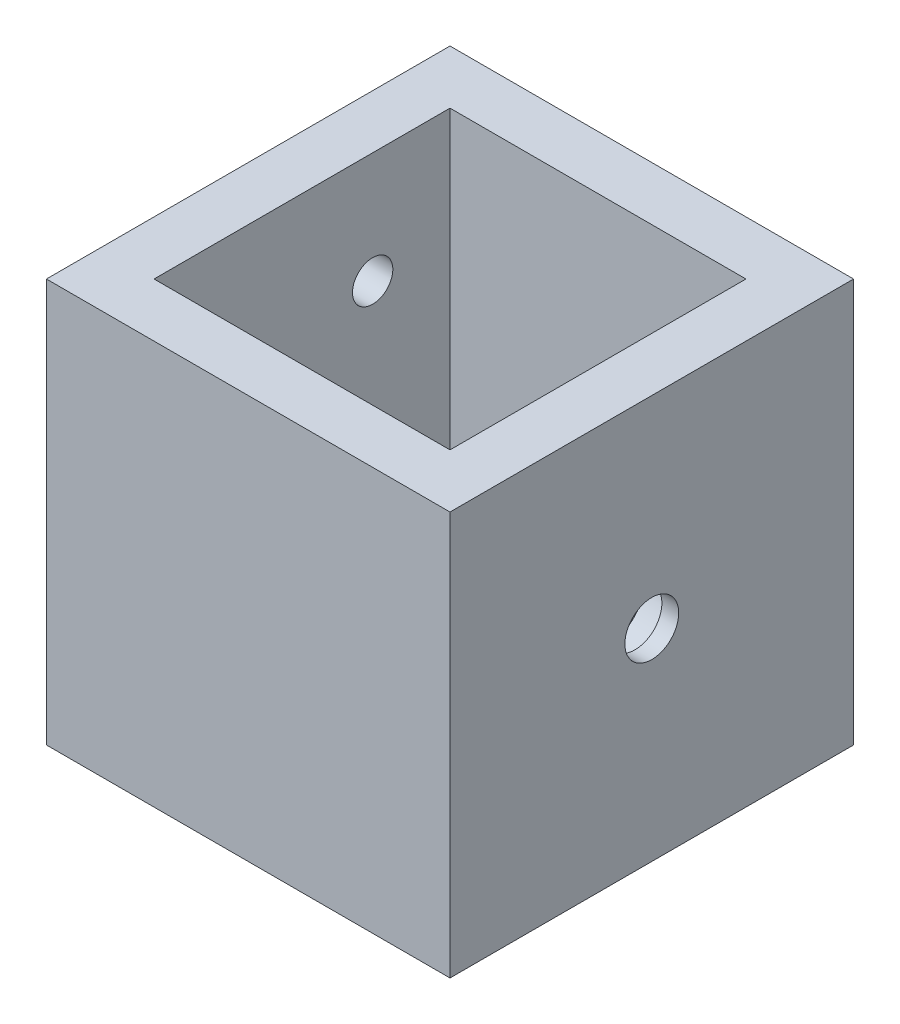
ISO-10303-21;
HEADER;
FILE_DESCRIPTION(('STEP AP214'),'2;1');
FILE_NAME('part.step','',(''),(''),'','','');
FILE_SCHEMA(('AUTOMOTIVE_DESIGN { 1 0 10303 214 1 1 1 1 }'));
ENDSEC;
DATA;
#1=APPLICATION_CONTEXT('core data for automotive mechanical design processes');
#2=APPLICATION_PROTOCOL_DEFINITION('international standard','automotive_design',2000,#1);
#3=PRODUCT_CONTEXT('',#1,'mechanical');
#4=PRODUCT('Part','Part','',(#3));
#5=PRODUCT_RELATED_PRODUCT_CATEGORY('part','',(#4));
#6=PRODUCT_DEFINITION_FORMATION('','',#4);
#7=PRODUCT_DEFINITION_CONTEXT('part definition',#1,'design');
#8=PRODUCT_DEFINITION('design','',#6,#7);
#9=PRODUCT_DEFINITION_SHAPE('','',#8);
#10=(LENGTH_UNIT() NAMED_UNIT(*) SI_UNIT(.MILLI.,.METRE.));
#11=(NAMED_UNIT(*) PLANE_ANGLE_UNIT() SI_UNIT($,.RADIAN.));
#12=(NAMED_UNIT(*) SI_UNIT($,.STERADIAN.) SOLID_ANGLE_UNIT());
#13=UNCERTAINTY_MEASURE_WITH_UNIT(LENGTH_MEASURE(1.E-05),#10,'distance_accuracy_value','');
#14=(GEOMETRIC_REPRESENTATION_CONTEXT(3) GLOBAL_UNCERTAINTY_ASSIGNED_CONTEXT((#13)) GLOBAL_UNIT_ASSIGNED_CONTEXT((#10,
#11,#12)) REPRESENTATION_CONTEXT('',''));
#15=CARTESIAN_POINT('',(0.,0.,0.));
#16=DIRECTION('',(0.,0.,1.));
#17=DIRECTION('',(1.,0.,0.));
#18=AXIS2_PLACEMENT_3D('',#15,#16,#17);
#19=CARTESIAN_POINT('',(130.,30.,0.));
#20=DIRECTION('',(-1.,0.,0.));
#21=DIRECTION('',(0.,0.,1.));
#22=AXIS2_PLACEMENT_3D('',#19,#20,#21);
#23=CYLINDRICAL_SURFACE('',#22,4.);
#24=CARTESIAN_POINT('',(30.,30.,0.));
#25=DIRECTION('',(-1.,0.,0.));
#26=DIRECTION('',(0.,0.,1.));
#27=AXIS2_PLACEMENT_3D('',#24,#25,#26);
#28=CIRCLE('',#27,4.);
#29=CARTESIAN_POINT('',(30.,30.,3.99999999999998));
#30=VERTEX_POINT('',#29);
#31=EDGE_CURVE('E233',#30,#30,#28,.T.);
#32=ORIENTED_EDGE('',*,*,#31,.F.);
#33=EDGE_LOOP('',(#32));
#34=FACE_BOUND('',#33,.T.);
#35=CARTESIAN_POINT('',(27.5,30.,0.));
#36=DIRECTION('',(-1.,0.,0.));
#37=DIRECTION('',(0.,0.,1.));
#38=AXIS2_PLACEMENT_3D('',#35,#36,#37);
#39=CIRCLE('',#38,4.);
#40=CARTESIAN_POINT('',(27.5,30.,3.99999999999998));
#41=VERTEX_POINT('',#40);
#42=EDGE_CURVE('E129',#41,#41,#39,.F.);
#43=ORIENTED_EDGE('',*,*,#42,.F.);
#44=EDGE_LOOP('',(#43));
#45=FACE_BOUND('',#44,.T.);
#46=ADVANCED_FACE('F125',(#34,#45),#23,.F.);
#47=CARTESIAN_POINT('',(0.,60.,0.));
#48=DIRECTION('',(0.,1.,0.));
#49=DIRECTION('',(0.,0.,1.));
#50=AXIS2_PLACEMENT_3D('',#47,#48,#49);
#51=PLANE('',#50);
#52=DIRECTION('',(0.,0.,-1.));
#53=VECTOR('',#52,1.);
#54=CARTESIAN_POINT('',(30.,60.,-30.));
#55=LINE('',#54,#53);
#56=CARTESIAN_POINT('',(30.,60.,30.));
#57=VERTEX_POINT('',#56);
#58=CARTESIAN_POINT('',(30.,60.,-30.));
#59=VERTEX_POINT('',#58);
#60=EDGE_CURVE('E236',#57,#59,#55,.T.);
#61=ORIENTED_EDGE('',*,*,#60,.T.);
#62=DIRECTION('',(-1.,0.,0.));
#63=VECTOR('',#62,1.);
#64=CARTESIAN_POINT('',(-30.,60.,-30.));
#65=LINE('',#64,#63);
#66=CARTESIAN_POINT('',(-30.,60.,-30.));
#67=VERTEX_POINT('',#66);
#68=EDGE_CURVE('E240',#59,#67,#65,.T.);
#69=ORIENTED_EDGE('',*,*,#68,.T.);
#70=DIRECTION('',(0.,0.,1.));
#71=VECTOR('',#70,1.);
#72=CARTESIAN_POINT('',(-30.,60.,-30.));
#73=LINE('',#72,#71);
#74=CARTESIAN_POINT('',(-30.,60.,30.));
#75=VERTEX_POINT('',#74);
#76=EDGE_CURVE('E244',#67,#75,#73,.T.);
#77=ORIENTED_EDGE('',*,*,#76,.T.);
#78=DIRECTION('',(1.,0.,0.));
#79=VECTOR('',#78,1.);
#80=CARTESIAN_POINT('',(-30.,60.,30.));
#81=LINE('',#80,#79);
#82=EDGE_CURVE('E247',#75,#57,#81,.T.);
#83=ORIENTED_EDGE('',*,*,#82,.T.);
#84=EDGE_LOOP('',(#61,#69,#77,#83));
#85=FACE_BOUND('',#84,.T.);
#86=DIRECTION('',(-1.,0.,0.));
#87=VECTOR('',#86,1.);
#88=CARTESIAN_POINT('',(22.,60.,-22.));
#89=LINE('',#88,#87);
#90=CARTESIAN_POINT('',(22.,60.,-22.));
#91=VERTEX_POINT('',#90);
#92=CARTESIAN_POINT('',(-22.,60.,-22.));
#93=VERTEX_POINT('',#92);
#94=EDGE_CURVE('E204',#91,#93,#89,.T.);
#95=ORIENTED_EDGE('',*,*,#94,.F.);
#96=DIRECTION('',(0.,0.,-1.));
#97=VECTOR('',#96,1.);
#98=CARTESIAN_POINT('',(22.,60.,22.));
#99=LINE('',#98,#97);
#100=CARTESIAN_POINT('',(22.,60.,22.));
#101=VERTEX_POINT('',#100);
#102=EDGE_CURVE('E143',#101,#91,#99,.T.);
#103=ORIENTED_EDGE('',*,*,#102,.F.);
#104=DIRECTION('',(1.,0.,0.));
#105=VECTOR('',#104,1.);
#106=CARTESIAN_POINT('',(-22.,60.,22.));
#107=LINE('',#106,#105);
#108=CARTESIAN_POINT('',(-22.,60.,22.));
#109=VERTEX_POINT('',#108);
#110=EDGE_CURVE('E201',#109,#101,#107,.T.);
#111=ORIENTED_EDGE('',*,*,#110,.F.);
#112=DIRECTION('',(0.,0.,1.));
#113=VECTOR('',#112,1.);
#114=CARTESIAN_POINT('',(-22.,60.,-22.));
#115=LINE('',#114,#113);
#116=EDGE_CURVE('E195',#93,#109,#115,.T.);
#117=ORIENTED_EDGE('',*,*,#116,.F.);
#118=EDGE_LOOP('',(#95,#103,#111,#117));
#119=FACE_BOUND('',#118,.T.);
#120=ADVANCED_FACE('F211',(#85,#119),#51,.T.);
#121=CARTESIAN_POINT('',(0.,0.,0.));
#122=DIRECTION('',(0.,1.,0.));
#123=DIRECTION('',(0.,0.,1.));
#124=AXIS2_PLACEMENT_3D('',#121,#122,#123);
#125=PLANE('',#124);
#126=DIRECTION('',(0.,0.,-1.));
#127=VECTOR('',#126,1.);
#128=CARTESIAN_POINT('',(30.,0.,-30.));
#129=LINE('',#128,#127);
#130=CARTESIAN_POINT('',(30.,0.,30.));
#131=VERTEX_POINT('',#130);
#132=CARTESIAN_POINT('',(30.,0.,-30.));
#133=VERTEX_POINT('',#132);
#134=EDGE_CURVE('E209',#131,#133,#129,.T.);
#135=ORIENTED_EDGE('',*,*,#134,.F.);
#136=DIRECTION('',(1.,0.,0.));
#137=VECTOR('',#136,1.);
#138=CARTESIAN_POINT('',(-30.,0.,30.));
#139=LINE('',#138,#137);
#140=CARTESIAN_POINT('',(-30.,0.,30.));
#141=VERTEX_POINT('',#140);
#142=EDGE_CURVE('E241',#141,#131,#139,.T.);
#143=ORIENTED_EDGE('',*,*,#142,.F.);
#144=DIRECTION('',(0.,0.,1.));
#145=VECTOR('',#144,1.);
#146=CARTESIAN_POINT('',(-30.,0.,-30.));
#147=LINE('',#146,#145);
#148=CARTESIAN_POINT('',(-30.,0.,-30.));
#149=VERTEX_POINT('',#148);
#150=EDGE_CURVE('E257',#149,#141,#147,.T.);
#151=ORIENTED_EDGE('',*,*,#150,.F.);
#152=DIRECTION('',(-1.,0.,0.));
#153=VECTOR('',#152,1.);
#154=CARTESIAN_POINT('',(-30.,0.,-30.));
#155=LINE('',#154,#153);
#156=EDGE_CURVE('E254',#133,#149,#155,.T.);
#157=ORIENTED_EDGE('',*,*,#156,.F.);
#158=EDGE_LOOP('',(#135,#143,#151,#157));
#159=FACE_BOUND('',#158,.T.);
#160=DIRECTION('',(0.,0.,1.));
#161=VECTOR('',#160,1.);
#162=CARTESIAN_POINT('',(22.,0.,0.));
#163=LINE('',#162,#161);
#164=CARTESIAN_POINT('',(22.,0.,-22.));
#165=VERTEX_POINT('',#164);
#166=CARTESIAN_POINT('',(22.,0.,22.));
#167=VERTEX_POINT('',#166);
#168=EDGE_CURVE('E14',#165,#167,#163,.T.);
#169=ORIENTED_EDGE('',*,*,#168,.F.);
#170=DIRECTION('',(1.,0.,0.));
#171=VECTOR('',#170,1.);
#172=CARTESIAN_POINT('',(0.,0.,-22.));
#173=LINE('',#172,#171);
#174=CARTESIAN_POINT('',(-22.,0.,-22.));
#175=VERTEX_POINT('',#174);
#176=EDGE_CURVE('E277',#175,#165,#173,.T.);
#177=ORIENTED_EDGE('',*,*,#176,.F.);
#178=DIRECTION('',(0.,0.,-1.));
#179=VECTOR('',#178,1.);
#180=CARTESIAN_POINT('',(-22.,0.,0.));
#181=LINE('',#180,#179);
#182=CARTESIAN_POINT('',(-22.,0.,22.));
#183=VERTEX_POINT('',#182);
#184=EDGE_CURVE('E198',#183,#175,#181,.T.);
#185=ORIENTED_EDGE('',*,*,#184,.F.);
#186=DIRECTION('',(-1.,0.,0.));
#187=VECTOR('',#186,1.);
#188=CARTESIAN_POINT('',(0.,0.,22.));
#189=LINE('',#188,#187);
#190=EDGE_CURVE('E135',#167,#183,#189,.T.);
#191=ORIENTED_EDGE('',*,*,#190,.F.);
#192=EDGE_LOOP('',(#169,#177,#185,#191));
#193=FACE_BOUND('',#192,.T.);
#194=ADVANCED_FACE('F322',(#159,#193),#125,.F.);
#195=CARTESIAN_POINT('',(30.,60.,-30.));
#196=DIRECTION('',(-1.,0.,0.));
#197=DIRECTION('',(0.,0.,1.));
#198=AXIS2_PLACEMENT_3D('',#195,#196,#197);
#199=PLANE('',#198);
#200=ORIENTED_EDGE('',*,*,#31,.T.);
#201=EDGE_LOOP('',(#200));
#202=FACE_BOUND('',#201,.T.);
#203=ORIENTED_EDGE('',*,*,#134,.T.);
#204=DIRECTION('',(0.,-1.,0.));
#205=VECTOR('',#204,1.);
#206=CARTESIAN_POINT('',(30.,60.,-30.));
#207=LINE('',#206,#205);
#208=EDGE_CURVE('E273',#59,#133,#207,.T.);
#209=ORIENTED_EDGE('',*,*,#208,.F.);
#210=ORIENTED_EDGE('',*,*,#60,.F.);
#211=DIRECTION('',(0.,-1.,0.));
#212=VECTOR('',#211,1.);
#213=CARTESIAN_POINT('',(30.,60.,30.));
#214=LINE('',#213,#212);
#215=EDGE_CURVE('E250',#57,#131,#214,.T.);
#216=ORIENTED_EDGE('',*,*,#215,.T.);
#217=EDGE_LOOP('',(#203,#209,#210,#216));
#218=FACE_BOUND('',#217,.T.);
#219=ADVANCED_FACE('F127',(#202,#218),#199,.F.);
#220=CARTESIAN_POINT('',(-30.,60.,-30.));
#221=DIRECTION('',(0.,0.,1.));
#222=DIRECTION('',(1.,0.,0.));
#223=AXIS2_PLACEMENT_3D('',#220,#221,#222);
#224=PLANE('',#223);
#225=ORIENTED_EDGE('',*,*,#156,.T.);
#226=DIRECTION('',(0.,-1.,0.));
#227=VECTOR('',#226,1.);
#228=CARTESIAN_POINT('',(-30.,60.,-30.));
#229=LINE('',#228,#227);
#230=EDGE_CURVE('E269',#67,#149,#229,.T.);
#231=ORIENTED_EDGE('',*,*,#230,.F.);
#232=ORIENTED_EDGE('',*,*,#68,.F.);
#233=ORIENTED_EDGE('',*,*,#208,.T.);
#234=EDGE_LOOP('',(#225,#231,#232,#233));
#235=FACE_BOUND('',#234,.T.);
#236=ADVANCED_FACE('F399',(#235),#224,.F.);
#237=CARTESIAN_POINT('',(-30.,60.,-30.));
#238=DIRECTION('',(1.,0.,0.));
#239=DIRECTION('',(0.,0.,-1.));
#240=AXIS2_PLACEMENT_3D('',#237,#238,#239);
#241=PLANE('',#240);
#242=CARTESIAN_POINT('',(-30.,16.5,-10.5));
#243=DIRECTION('',(-1.,0.,0.));
#244=DIRECTION('',(0.,0.,1.));
#245=AXIS2_PLACEMENT_3D('',#242,#243,#244);
#246=CIRCLE('',#245,3.);
#247=CARTESIAN_POINT('',(-30.,16.5,-7.49999999999999));
#248=VERTEX_POINT('',#247);
#249=EDGE_CURVE('E376',#248,#248,#246,.T.);
#250=ORIENTED_EDGE('',*,*,#249,.F.);
#251=EDGE_LOOP('',(#250));
#252=FACE_BOUND('',#251,.T.);
#253=CARTESIAN_POINT('',(-30.,16.5,10.5));
#254=DIRECTION('',(-1.,0.,0.));
#255=DIRECTION('',(0.,0.,1.));
#256=AXIS2_PLACEMENT_3D('',#253,#254,#255);
#257=CIRCLE('',#256,3.);
#258=CARTESIAN_POINT('',(-30.,16.5,13.5));
#259=VERTEX_POINT('',#258);
#260=EDGE_CURVE('E380',#259,#259,#257,.T.);
#261=ORIENTED_EDGE('',*,*,#260,.F.);
#262=EDGE_LOOP('',(#261));
#263=FACE_BOUND('',#262,.T.);
#264=CARTESIAN_POINT('',(-30.,43.5,10.5));
#265=DIRECTION('',(-1.,0.,0.));
#266=DIRECTION('',(0.,0.,1.));
#267=AXIS2_PLACEMENT_3D('',#264,#265,#266);
#268=CIRCLE('',#267,3.);
#269=CARTESIAN_POINT('',(-30.,43.5,13.5));
#270=VERTEX_POINT('',#269);
#271=EDGE_CURVE('E387',#270,#270,#268,.T.);
#272=ORIENTED_EDGE('',*,*,#271,.F.);
#273=EDGE_LOOP('',(#272));
#274=FACE_BOUND('',#273,.T.);
#275=CARTESIAN_POINT('',(-30.,43.5,-10.5));
#276=DIRECTION('',(-1.,0.,0.));
#277=DIRECTION('',(0.,0.,1.));
#278=AXIS2_PLACEMENT_3D('',#275,#276,#277);
#279=CIRCLE('',#278,3.);
#280=CARTESIAN_POINT('',(-30.,43.5,-7.49999999999999));
#281=VERTEX_POINT('',#280);
#282=EDGE_CURVE('E289',#281,#281,#279,.T.);
#283=ORIENTED_EDGE('',*,*,#282,.F.);
#284=EDGE_LOOP('',(#283));
#285=FACE_BOUND('',#284,.T.);
#286=ORIENTED_EDGE('',*,*,#150,.T.);
#287=DIRECTION('',(0.,-1.,0.));
#288=VECTOR('',#287,1.);
#289=CARTESIAN_POINT('',(-30.,60.,30.));
#290=LINE('',#289,#288);
#291=EDGE_CURVE('E265',#75,#141,#290,.T.);
#292=ORIENTED_EDGE('',*,*,#291,.F.);
#293=ORIENTED_EDGE('',*,*,#76,.F.);
#294=ORIENTED_EDGE('',*,*,#230,.T.);
#295=EDGE_LOOP('',(#286,#292,#293,#294));
#296=FACE_BOUND('',#295,.T.);
#297=ADVANCED_FACE('F396',(#252,#263,#274,#285,#296),#241,.F.);
#298=CARTESIAN_POINT('',(-30.,60.,30.));
#299=DIRECTION('',(0.,0.,-1.));
#300=DIRECTION('',(-1.,0.,0.));
#301=AXIS2_PLACEMENT_3D('',#298,#299,#300);
#302=PLANE('',#301);
#303=ORIENTED_EDGE('',*,*,#142,.T.);
#304=ORIENTED_EDGE('',*,*,#215,.F.);
#305=ORIENTED_EDGE('',*,*,#82,.F.);
#306=ORIENTED_EDGE('',*,*,#291,.T.);
#307=EDGE_LOOP('',(#303,#304,#305,#306));
#308=FACE_BOUND('',#307,.T.);
#309=ADVANCED_FACE('F333',(#308),#302,.F.);
#310=CARTESIAN_POINT('',(22.,60.,22.));
#311=DIRECTION('',(-1.,0.,0.));
#312=DIRECTION('',(0.,0.,1.));
#313=AXIS2_PLACEMENT_3D('',#310,#311,#312);
#314=PLANE('',#313);
#315=CARTESIAN_POINT('',(22.,30.,0.));
#316=DIRECTION('',(-1.,0.,0.));
#317=DIRECTION('',(0.,0.,1.));
#318=AXIS2_PLACEMENT_3D('',#315,#316,#317);
#319=CIRCLE('',#318,7.5);
#320=CARTESIAN_POINT('',(22.,30.,7.49999999999998));
#321=VERTEX_POINT('',#320);
#322=EDGE_CURVE('E381',#321,#321,#319,.T.);
#323=ORIENTED_EDGE('',*,*,#322,.F.);
#324=EDGE_LOOP('',(#323));
#325=FACE_BOUND('',#324,.T.);
#326=ORIENTED_EDGE('',*,*,#168,.T.);
#327=DIRECTION('',(0.,-1.,0.));
#328=VECTOR('',#327,1.);
#329=CARTESIAN_POINT('',(22.,60.,22.));
#330=LINE('',#329,#328);
#331=EDGE_CURVE('E229',#101,#167,#330,.T.);
#332=ORIENTED_EDGE('',*,*,#331,.F.);
#333=ORIENTED_EDGE('',*,*,#102,.T.);
#334=DIRECTION('',(0.,-1.,0.));
#335=VECTOR('',#334,1.);
#336=CARTESIAN_POINT('',(22.,60.,-22.));
#337=LINE('',#336,#335);
#338=EDGE_CURVE('E206',#91,#165,#337,.T.);
#339=ORIENTED_EDGE('',*,*,#338,.T.);
#340=EDGE_LOOP('',(#326,#332,#333,#339));
#341=FACE_BOUND('',#340,.T.);
#342=ADVANCED_FACE('F319',(#325,#341),#314,.T.);
#343=CARTESIAN_POINT('',(-22.,60.,22.));
#344=DIRECTION('',(0.,0.,-1.));
#345=DIRECTION('',(-1.,0.,0.));
#346=AXIS2_PLACEMENT_3D('',#343,#344,#345);
#347=PLANE('',#346);
#348=ORIENTED_EDGE('',*,*,#190,.T.);
#349=DIRECTION('',(0.,-1.,0.));
#350=VECTOR('',#349,1.);
#351=CARTESIAN_POINT('',(-22.,60.,22.));
#352=LINE('',#351,#350);
#353=EDGE_CURVE('E220',#109,#183,#352,.T.);
#354=ORIENTED_EDGE('',*,*,#353,.F.);
#355=ORIENTED_EDGE('',*,*,#110,.T.);
#356=ORIENTED_EDGE('',*,*,#331,.T.);
#357=EDGE_LOOP('',(#348,#354,#355,#356));
#358=FACE_BOUND('',#357,.T.);
#359=ADVANCED_FACE('F324',(#358),#347,.T.);
#360=CARTESIAN_POINT('',(-22.,60.,-22.));
#361=DIRECTION('',(1.,0.,0.));
#362=DIRECTION('',(0.,0.,-1.));
#363=AXIS2_PLACEMENT_3D('',#360,#361,#362);
#364=PLANE('',#363);
#365=CARTESIAN_POINT('',(-22.,16.5,-10.5));
#366=DIRECTION('',(1.,0.,0.));
#367=DIRECTION('',(0.,0.,-1.));
#368=AXIS2_PLACEMENT_3D('',#365,#366,#367);
#369=CIRCLE('',#368,3.);
#370=CARTESIAN_POINT('',(-22.,16.5,-7.49999999999999));
#371=VERTEX_POINT('',#370);
#372=EDGE_CURVE('E296',#371,#371,#369,.T.);
#373=ORIENTED_EDGE('',*,*,#372,.F.);
#374=EDGE_LOOP('',(#373));
#375=FACE_BOUND('',#374,.T.);
#376=CARTESIAN_POINT('',(-22.,16.5,10.5));
#377=DIRECTION('',(1.,0.,0.));
#378=DIRECTION('',(0.,0.,-1.));
#379=AXIS2_PLACEMENT_3D('',#376,#377,#378);
#380=CIRCLE('',#379,3.);
#381=CARTESIAN_POINT('',(-22.,16.5,13.5));
#382=VERTEX_POINT('',#381);
#383=EDGE_CURVE('E293',#382,#382,#380,.T.);
#384=ORIENTED_EDGE('',*,*,#383,.F.);
#385=EDGE_LOOP('',(#384));
#386=FACE_BOUND('',#385,.T.);
#387=CARTESIAN_POINT('',(-22.,43.5,10.5));
#388=DIRECTION('',(1.,0.,0.));
#389=DIRECTION('',(0.,0.,-1.));
#390=AXIS2_PLACEMENT_3D('',#387,#388,#389);
#391=CIRCLE('',#390,3.);
#392=CARTESIAN_POINT('',(-22.,43.5,13.5));
#393=VERTEX_POINT('',#392);
#394=EDGE_CURVE('E288',#393,#393,#391,.T.);
#395=ORIENTED_EDGE('',*,*,#394,.F.);
#396=EDGE_LOOP('',(#395));
#397=FACE_BOUND('',#396,.T.);
#398=CARTESIAN_POINT('',(-22.,43.5,-10.5));
#399=DIRECTION('',(1.,0.,0.));
#400=DIRECTION('',(0.,0.,-1.));
#401=AXIS2_PLACEMENT_3D('',#398,#399,#400);
#402=CIRCLE('',#401,3.);
#403=CARTESIAN_POINT('',(-22.,43.5,-7.5));
#404=VERTEX_POINT('',#403);
#405=EDGE_CURVE('E284',#404,#404,#402,.T.);
#406=ORIENTED_EDGE('',*,*,#405,.F.);
#407=EDGE_LOOP('',(#406));
#408=FACE_BOUND('',#407,.T.);
#409=ORIENTED_EDGE('',*,*,#184,.T.);
#410=DIRECTION('',(0.,-1.,0.));
#411=VECTOR('',#410,1.);
#412=CARTESIAN_POINT('',(-22.,60.,-22.));
#413=LINE('',#412,#411);
#414=EDGE_CURVE('E151',#93,#175,#413,.T.);
#415=ORIENTED_EDGE('',*,*,#414,.F.);
#416=ORIENTED_EDGE('',*,*,#116,.T.);
#417=ORIENTED_EDGE('',*,*,#353,.T.);
#418=EDGE_LOOP('',(#409,#415,#416,#417));
#419=FACE_BOUND('',#418,.T.);
#420=ADVANCED_FACE('F192',(#375,#386,#397,#408,#419),#364,.T.);
#421=CARTESIAN_POINT('',(22.,60.,-22.));
#422=DIRECTION('',(0.,0.,1.));
#423=DIRECTION('',(1.,0.,0.));
#424=AXIS2_PLACEMENT_3D('',#421,#422,#423);
#425=PLANE('',#424);
#426=ORIENTED_EDGE('',*,*,#176,.T.);
#427=ORIENTED_EDGE('',*,*,#338,.F.);
#428=ORIENTED_EDGE('',*,*,#94,.T.);
#429=ORIENTED_EDGE('',*,*,#414,.T.);
#430=EDGE_LOOP('',(#426,#427,#428,#429));
#431=FACE_BOUND('',#430,.T.);
#432=ADVANCED_FACE('F205',(#431),#425,.T.);
#433=CARTESIAN_POINT('',(0.,43.5,-10.5));
#434=DIRECTION('',(-1.,0.,0.));
#435=DIRECTION('',(0.,0.,1.));
#436=AXIS2_PLACEMENT_3D('',#433,#434,#435);
#437=CYLINDRICAL_SURFACE('',#436,3.);
#438=CARTESIAN_POINT('',(-22.,43.5,-7.5));
#439=CARTESIAN_POINT('',(-22.0833333333333,43.5,-7.5));
#440=CARTESIAN_POINT('',(-22.1666666666667,43.5,-7.5));
#441=CARTESIAN_POINT('',(-22.3333333333333,43.5,-7.5));
#442=CARTESIAN_POINT('',(-22.4166666666667,43.5,-7.5));
#443=CARTESIAN_POINT('',(-22.5833333333333,43.5,-7.5));
#444=CARTESIAN_POINT('',(-22.6666666666667,43.5,-7.5));
#445=CARTESIAN_POINT('',(-22.8333333333333,43.5,-7.5));
#446=CARTESIAN_POINT('',(-22.9166666666667,43.5,-7.5));
#447=CARTESIAN_POINT('',(-23.0833333333333,43.5,-7.5));
#448=CARTESIAN_POINT('',(-23.1666666666667,43.5,-7.5));
#449=CARTESIAN_POINT('',(-23.3333333333333,43.5,-7.5));
#450=CARTESIAN_POINT('',(-23.4166666666667,43.5,-7.5));
#451=CARTESIAN_POINT('',(-23.5833333333333,43.5,-7.5));
#452=CARTESIAN_POINT('',(-23.6666666666667,43.5,-7.5));
#453=CARTESIAN_POINT('',(-23.8333333333333,43.5,-7.5));
#454=CARTESIAN_POINT('',(-23.9166666666667,43.5,-7.5));
#455=CARTESIAN_POINT('',(-24.0833333333333,43.5,-7.5));
#456=CARTESIAN_POINT('',(-24.1666666666667,43.5,-7.5));
#457=CARTESIAN_POINT('',(-24.3333333333333,43.5,-7.5));
#458=CARTESIAN_POINT('',(-24.4166666666667,43.5,-7.5));
#459=CARTESIAN_POINT('',(-24.5833333333333,43.5,-7.5));
#460=CARTESIAN_POINT('',(-24.6666666666667,43.5,-7.5));
#461=CARTESIAN_POINT('',(-24.8333333333333,43.5,-7.5));
#462=CARTESIAN_POINT('',(-24.9166666666667,43.5,-7.5));
#463=CARTESIAN_POINT('',(-25.0833333333333,43.5,-7.5));
#464=CARTESIAN_POINT('',(-25.1666666666667,43.5,-7.5));
#465=CARTESIAN_POINT('',(-25.3333333333333,43.5,-7.5));
#466=CARTESIAN_POINT('',(-25.4166666666667,43.5,-7.5));
#467=CARTESIAN_POINT('',(-25.5833333333333,43.5,-7.5));
#468=CARTESIAN_POINT('',(-25.6666666666667,43.5,-7.5));
#469=CARTESIAN_POINT('',(-25.8333333333333,43.5,-7.5));
#470=CARTESIAN_POINT('',(-25.9166666666667,43.5,-7.5));
#471=CARTESIAN_POINT('',(-26.0833333333333,43.5,-7.5));
#472=CARTESIAN_POINT('',(-26.1666666666667,43.5,-7.49999999999999));
#473=CARTESIAN_POINT('',(-26.3333333333333,43.5,-7.49999999999999));
#474=CARTESIAN_POINT('',(-26.4166666666667,43.5,-7.49999999999999));
#475=CARTESIAN_POINT('',(-26.5833333333333,43.5,-7.49999999999999));
#476=CARTESIAN_POINT('',(-26.6666666666667,43.5,-7.49999999999999));
#477=CARTESIAN_POINT('',(-26.8333333333333,43.5,-7.49999999999999));
#478=CARTESIAN_POINT('',(-26.9166666666667,43.5,-7.49999999999999));
#479=CARTESIAN_POINT('',(-27.0833333333333,43.5,-7.49999999999999));
#480=CARTESIAN_POINT('',(-27.1666666666667,43.5,-7.49999999999999));
#481=CARTESIAN_POINT('',(-27.3333333333333,43.5,-7.49999999999999));
#482=CARTESIAN_POINT('',(-27.4166666666667,43.5,-7.49999999999999));
#483=CARTESIAN_POINT('',(-27.5833333333333,43.5,-7.49999999999999));
#484=CARTESIAN_POINT('',(-27.6666666666667,43.5,-7.49999999999999));
#485=CARTESIAN_POINT('',(-27.8333333333333,43.5,-7.49999999999999));
#486=CARTESIAN_POINT('',(-27.9166666666667,43.5,-7.49999999999999));
#487=CARTESIAN_POINT('',(-28.0833333333333,43.5,-7.49999999999999));
#488=CARTESIAN_POINT('',(-28.1666666666667,43.5,-7.49999999999999));
#489=CARTESIAN_POINT('',(-28.3333333333333,43.5,-7.49999999999999));
#490=CARTESIAN_POINT('',(-28.4166666666667,43.5,-7.49999999999999));
#491=CARTESIAN_POINT('',(-28.5833333333333,43.5,-7.49999999999999));
#492=CARTESIAN_POINT('',(-28.6666666666667,43.5,-7.49999999999999));
#493=CARTESIAN_POINT('',(-28.8333333333333,43.5,-7.49999999999999));
#494=CARTESIAN_POINT('',(-28.9166666666667,43.5,-7.49999999999999));
#495=CARTESIAN_POINT('',(-29.0833333333333,43.5,-7.49999999999999));
#496=CARTESIAN_POINT('',(-29.1666666666667,43.5,-7.49999999999999));
#497=CARTESIAN_POINT('',(-29.3333333333333,43.5,-7.49999999999999));
#498=CARTESIAN_POINT('',(-29.4166666666667,43.5,-7.49999999999999));
#499=CARTESIAN_POINT('',(-29.5833333333333,43.5,-7.49999999999999));
#500=CARTESIAN_POINT('',(-29.6666666666667,43.5,-7.49999999999999));
#501=CARTESIAN_POINT('',(-29.8333333333333,43.5,-7.49999999999999));
#502=CARTESIAN_POINT('',(-29.9166666666667,43.5,-7.49999999999999));
#503=CARTESIAN_POINT('',(-30.,43.5,-7.49999999999999));
#504=B_SPLINE_CURVE_WITH_KNOTS('',3,(#438,#439,#440,#441,#442,#443,#444,#445,#446,#447,#448,
#449,#450,#451,#452,#453,#454,#455,#456,#457,#458,#459,#460,#461,#462,#463,#464,#465,#466,#467,
#468,#469,#470,#471,#472,#473,#474,#475,#476,#477,#478,#479,#480,#481,#482,#483,#484,#485,#486,
#487,#488,#489,#490,#491,#492,#493,#494,#495,#496,#497,#498,#499,#500,#501,#502,#503),
.UNSPECIFIED.,.F.,.F.,(4,2,2,2,2,2,2,2,2,2,2,2,2,2,2,2,2,2,2,2,2,2,2,2,2,2,2,2,2,2,2,2,4),(0.,
0.25,0.5,0.749999999999997,0.999999999999997,1.25,1.5,1.75,1.99999999999999,2.25,2.5,2.75,3.,
3.25,3.49999999999999,3.74999999999999,3.99999999999999,4.24999999999999,4.49999999999999,
4.74999999999999,4.99999999999999,5.24999999999999,5.49999999999999,5.74999999999999,
5.99999999999999,6.24999999999999,6.49999999999999,6.74999999999999,6.99999999999999,
7.24999999999999,7.49999999999999,7.74999999999999,7.99999999999999),.UNSPECIFIED.);
#505=EDGE_CURVE('BSEAM345',#404,#281,#504,.T.);
#506=ORIENTED_EDGE('',*,*,#405,.T.);
#507=ORIENTED_EDGE('',*,*,#282,.T.);
#508=ORIENTED_EDGE('',*,*,#505,.T.);
#509=ORIENTED_EDGE('',*,*,#505,.F.);
#510=EDGE_LOOP('',(#506,#508,#507,#509));
#511=FACE_BOUND('',#510,.T.);
#512=ADVANCED_FACE('F345',(#511),#437,.F.);
#513=CARTESIAN_POINT('',(0.,43.5,10.5));
#514=DIRECTION('',(-1.,0.,0.));
#515=DIRECTION('',(0.,0.,1.));
#516=AXIS2_PLACEMENT_3D('',#513,#514,#515);
#517=CYLINDRICAL_SURFACE('',#516,3.);
#518=CARTESIAN_POINT('',(-22.,43.5,13.5));
#519=CARTESIAN_POINT('',(-22.0833333333333,43.5,13.5));
#520=CARTESIAN_POINT('',(-22.1666666666667,43.5,13.5));
#521=CARTESIAN_POINT('',(-22.3333333333333,43.5,13.5));
#522=CARTESIAN_POINT('',(-22.4166666666667,43.5,13.5));
#523=CARTESIAN_POINT('',(-22.5833333333333,43.5,13.5));
#524=CARTESIAN_POINT('',(-22.6666666666667,43.5,13.5));
#525=CARTESIAN_POINT('',(-22.8333333333333,43.5,13.5));
#526=CARTESIAN_POINT('',(-22.9166666666667,43.5,13.5));
#527=CARTESIAN_POINT('',(-23.0833333333333,43.5,13.5));
#528=CARTESIAN_POINT('',(-23.1666666666667,43.5,13.5));
#529=CARTESIAN_POINT('',(-23.3333333333333,43.5,13.5));
#530=CARTESIAN_POINT('',(-23.4166666666667,43.5,13.5));
#531=CARTESIAN_POINT('',(-23.5833333333333,43.5,13.5));
#532=CARTESIAN_POINT('',(-23.6666666666667,43.5,13.5));
#533=CARTESIAN_POINT('',(-23.8333333333333,43.5,13.5));
#534=CARTESIAN_POINT('',(-23.9166666666667,43.5,13.5));
#535=CARTESIAN_POINT('',(-24.0833333333333,43.5,13.5));
#536=CARTESIAN_POINT('',(-24.1666666666667,43.5,13.5));
#537=CARTESIAN_POINT('',(-24.3333333333333,43.5,13.5));
#538=CARTESIAN_POINT('',(-24.4166666666667,43.5,13.5));
#539=CARTESIAN_POINT('',(-24.5833333333333,43.5,13.5));
#540=CARTESIAN_POINT('',(-24.6666666666667,43.5,13.5));
#541=CARTESIAN_POINT('',(-24.8333333333333,43.5,13.5));
#542=CARTESIAN_POINT('',(-24.9166666666667,43.5,13.5));
#543=CARTESIAN_POINT('',(-25.0833333333333,43.5,13.5));
#544=CARTESIAN_POINT('',(-25.1666666666667,43.5,13.5));
#545=CARTESIAN_POINT('',(-25.3333333333333,43.5,13.5));
#546=CARTESIAN_POINT('',(-25.4166666666667,43.5,13.5));
#547=CARTESIAN_POINT('',(-25.5833333333333,43.5,13.5));
#548=CARTESIAN_POINT('',(-25.6666666666667,43.5,13.5));
#549=CARTESIAN_POINT('',(-25.8333333333333,43.5,13.5));
#550=CARTESIAN_POINT('',(-25.9166666666667,43.5,13.5));
#551=CARTESIAN_POINT('',(-26.0833333333333,43.5,13.5));
#552=CARTESIAN_POINT('',(-26.1666666666667,43.5,13.5));
#553=CARTESIAN_POINT('',(-26.3333333333333,43.5,13.5));
#554=CARTESIAN_POINT('',(-26.4166666666667,43.5,13.5));
#555=CARTESIAN_POINT('',(-26.5833333333333,43.5,13.5));
#556=CARTESIAN_POINT('',(-26.6666666666667,43.5,13.5));
#557=CARTESIAN_POINT('',(-26.8333333333333,43.5,13.5));
#558=CARTESIAN_POINT('',(-26.9166666666667,43.5,13.5));
#559=CARTESIAN_POINT('',(-27.0833333333333,43.5,13.5));
#560=CARTESIAN_POINT('',(-27.1666666666667,43.5,13.5));
#561=CARTESIAN_POINT('',(-27.3333333333333,43.5,13.5));
#562=CARTESIAN_POINT('',(-27.4166666666667,43.5,13.5));
#563=CARTESIAN_POINT('',(-27.5833333333333,43.5,13.5));
#564=CARTESIAN_POINT('',(-27.6666666666667,43.5,13.5));
#565=CARTESIAN_POINT('',(-27.8333333333333,43.5,13.5));
#566=CARTESIAN_POINT('',(-27.9166666666667,43.5,13.5));
#567=CARTESIAN_POINT('',(-28.0833333333333,43.5,13.5));
#568=CARTESIAN_POINT('',(-28.1666666666667,43.5,13.5));
#569=CARTESIAN_POINT('',(-28.3333333333333,43.5,13.5));
#570=CARTESIAN_POINT('',(-28.4166666666667,43.5,13.5));
#571=CARTESIAN_POINT('',(-28.5833333333333,43.5,13.5));
#572=CARTESIAN_POINT('',(-28.6666666666667,43.5,13.5));
#573=CARTESIAN_POINT('',(-28.8333333333333,43.5,13.5));
#574=CARTESIAN_POINT('',(-28.9166666666667,43.5,13.5));
#575=CARTESIAN_POINT('',(-29.0833333333333,43.5,13.5));
#576=CARTESIAN_POINT('',(-29.1666666666667,43.5,13.5));
#577=CARTESIAN_POINT('',(-29.3333333333333,43.5,13.5));
#578=CARTESIAN_POINT('',(-29.4166666666667,43.5,13.5));
#579=CARTESIAN_POINT('',(-29.5833333333333,43.5,13.5));
#580=CARTESIAN_POINT('',(-29.6666666666667,43.5,13.5));
#581=CARTESIAN_POINT('',(-29.8333333333333,43.5,13.5));
#582=CARTESIAN_POINT('',(-29.9166666666667,43.5,13.5));
#583=CARTESIAN_POINT('',(-30.,43.5,13.5));
#584=B_SPLINE_CURVE_WITH_KNOTS('',3,(#518,#519,#520,#521,#522,#523,#524,#525,#526,#527,#528,
#529,#530,#531,#532,#533,#534,#535,#536,#537,#538,#539,#540,#541,#542,#543,#544,#545,#546,#547,
#548,#549,#550,#551,#552,#553,#554,#555,#556,#557,#558,#559,#560,#561,#562,#563,#564,#565,#566,
#567,#568,#569,#570,#571,#572,#573,#574,#575,#576,#577,#578,#579,#580,#581,#582,#583),
.UNSPECIFIED.,.F.,.F.,(4,2,2,2,2,2,2,2,2,2,2,2,2,2,2,2,2,2,2,2,2,2,2,2,2,2,2,2,2,2,2,2,4),(0.,
0.25,0.5,0.750000000000001,1.,1.25,1.5,1.75,2.,2.25,2.50000000000001,2.75000000000001,
3.00000000000001,3.25000000000001,3.50000000000001,3.75000000000001,4.00000000000001,
4.25000000000001,4.50000000000001,4.75000000000001,5.00000000000001,5.25000000000001,
5.50000000000001,5.75000000000001,6.00000000000001,6.25000000000001,6.50000000000001,
6.75000000000001,7.00000000000001,7.25000000000001,7.50000000000001,7.75000000000001,
8.00000000000001),.UNSPECIFIED.);
#585=EDGE_CURVE('BSEAM348',#393,#270,#584,.T.);
#586=ORIENTED_EDGE('',*,*,#394,.T.);
#587=ORIENTED_EDGE('',*,*,#271,.T.);
#588=ORIENTED_EDGE('',*,*,#585,.T.);
#589=ORIENTED_EDGE('',*,*,#585,.F.);
#590=EDGE_LOOP('',(#586,#588,#587,#589));
#591=FACE_BOUND('',#590,.T.);
#592=ADVANCED_FACE('F348',(#591),#517,.F.);
#593=CARTESIAN_POINT('',(0.,16.5,10.5));
#594=DIRECTION('',(-1.,0.,0.));
#595=DIRECTION('',(0.,0.,1.));
#596=AXIS2_PLACEMENT_3D('',#593,#594,#595);
#597=CYLINDRICAL_SURFACE('',#596,3.);
#598=CARTESIAN_POINT('',(-22.,16.5,13.5));
#599=CARTESIAN_POINT('',(-22.0833333333333,16.5,13.5));
#600=CARTESIAN_POINT('',(-22.1666666666667,16.5,13.5));
#601=CARTESIAN_POINT('',(-22.3333333333333,16.5,13.5));
#602=CARTESIAN_POINT('',(-22.4166666666667,16.5,13.5));
#603=CARTESIAN_POINT('',(-22.5833333333333,16.5,13.5));
#604=CARTESIAN_POINT('',(-22.6666666666667,16.5,13.5));
#605=CARTESIAN_POINT('',(-22.8333333333333,16.5,13.5));
#606=CARTESIAN_POINT('',(-22.9166666666667,16.5,13.5));
#607=CARTESIAN_POINT('',(-23.0833333333333,16.5,13.5));
#608=CARTESIAN_POINT('',(-23.1666666666667,16.5,13.5));
#609=CARTESIAN_POINT('',(-23.3333333333333,16.5,13.5));
#610=CARTESIAN_POINT('',(-23.4166666666667,16.5,13.5));
#611=CARTESIAN_POINT('',(-23.5833333333333,16.5,13.5));
#612=CARTESIAN_POINT('',(-23.6666666666667,16.5,13.5));
#613=CARTESIAN_POINT('',(-23.8333333333333,16.5,13.5));
#614=CARTESIAN_POINT('',(-23.9166666666667,16.5,13.5));
#615=CARTESIAN_POINT('',(-24.0833333333333,16.5,13.5));
#616=CARTESIAN_POINT('',(-24.1666666666667,16.5,13.5));
#617=CARTESIAN_POINT('',(-24.3333333333333,16.5,13.5));
#618=CARTESIAN_POINT('',(-24.4166666666667,16.5,13.5));
#619=CARTESIAN_POINT('',(-24.5833333333333,16.5,13.5));
#620=CARTESIAN_POINT('',(-24.6666666666667,16.5,13.5));
#621=CARTESIAN_POINT('',(-24.8333333333333,16.5,13.5));
#622=CARTESIAN_POINT('',(-24.9166666666667,16.5,13.5));
#623=CARTESIAN_POINT('',(-25.0833333333333,16.5,13.5));
#624=CARTESIAN_POINT('',(-25.1666666666667,16.5,13.5));
#625=CARTESIAN_POINT('',(-25.3333333333333,16.5,13.5));
#626=CARTESIAN_POINT('',(-25.4166666666667,16.5,13.5));
#627=CARTESIAN_POINT('',(-25.5833333333333,16.5,13.5));
#628=CARTESIAN_POINT('',(-25.6666666666667,16.5,13.5));
#629=CARTESIAN_POINT('',(-25.8333333333333,16.5,13.5));
#630=CARTESIAN_POINT('',(-25.9166666666667,16.5,13.5));
#631=CARTESIAN_POINT('',(-26.0833333333333,16.5,13.5));
#632=CARTESIAN_POINT('',(-26.1666666666667,16.5,13.5));
#633=CARTESIAN_POINT('',(-26.3333333333333,16.5,13.5));
#634=CARTESIAN_POINT('',(-26.4166666666667,16.5,13.5));
#635=CARTESIAN_POINT('',(-26.5833333333333,16.5,13.5));
#636=CARTESIAN_POINT('',(-26.6666666666667,16.5,13.5));
#637=CARTESIAN_POINT('',(-26.8333333333333,16.5,13.5));
#638=CARTESIAN_POINT('',(-26.9166666666667,16.5,13.5));
#639=CARTESIAN_POINT('',(-27.0833333333333,16.5,13.5));
#640=CARTESIAN_POINT('',(-27.1666666666667,16.5,13.5));
#641=CARTESIAN_POINT('',(-27.3333333333333,16.5,13.5));
#642=CARTESIAN_POINT('',(-27.4166666666667,16.5,13.5));
#643=CARTESIAN_POINT('',(-27.5833333333333,16.5,13.5));
#644=CARTESIAN_POINT('',(-27.6666666666667,16.5,13.5));
#645=CARTESIAN_POINT('',(-27.8333333333333,16.5,13.5));
#646=CARTESIAN_POINT('',(-27.9166666666667,16.5,13.5));
#647=CARTESIAN_POINT('',(-28.0833333333333,16.5,13.5));
#648=CARTESIAN_POINT('',(-28.1666666666667,16.5,13.5));
#649=CARTESIAN_POINT('',(-28.3333333333333,16.5,13.5));
#650=CARTESIAN_POINT('',(-28.4166666666667,16.5,13.5));
#651=CARTESIAN_POINT('',(-28.5833333333333,16.5,13.5));
#652=CARTESIAN_POINT('',(-28.6666666666667,16.5,13.5));
#653=CARTESIAN_POINT('',(-28.8333333333333,16.5,13.5));
#654=CARTESIAN_POINT('',(-28.9166666666667,16.5,13.5));
#655=CARTESIAN_POINT('',(-29.0833333333333,16.5,13.5));
#656=CARTESIAN_POINT('',(-29.1666666666667,16.5,13.5));
#657=CARTESIAN_POINT('',(-29.3333333333333,16.5,13.5));
#658=CARTESIAN_POINT('',(-29.4166666666667,16.5,13.5));
#659=CARTESIAN_POINT('',(-29.5833333333333,16.5,13.5));
#660=CARTESIAN_POINT('',(-29.6666666666667,16.5,13.5));
#661=CARTESIAN_POINT('',(-29.8333333333333,16.5,13.5));
#662=CARTESIAN_POINT('',(-29.9166666666667,16.5,13.5));
#663=CARTESIAN_POINT('',(-30.,16.5,13.5));
#664=B_SPLINE_CURVE_WITH_KNOTS('',3,(#598,#599,#600,#601,#602,#603,#604,#605,#606,#607,#608,
#609,#610,#611,#612,#613,#614,#615,#616,#617,#618,#619,#620,#621,#622,#623,#624,#625,#626,#627,
#628,#629,#630,#631,#632,#633,#634,#635,#636,#637,#638,#639,#640,#641,#642,#643,#644,#645,#646,
#647,#648,#649,#650,#651,#652,#653,#654,#655,#656,#657,#658,#659,#660,#661,#662,#663),
.UNSPECIFIED.,.F.,.F.,(4,2,2,2,2,2,2,2,2,2,2,2,2,2,2,2,2,2,2,2,2,2,2,2,2,2,2,2,2,2,2,2,4),(0.,
0.25,0.5,0.750000000000001,1.,1.25,1.5,1.75,2.,2.25,2.50000000000001,2.75000000000001,
3.00000000000001,3.25000000000001,3.50000000000001,3.75000000000001,4.00000000000001,
4.25000000000001,4.50000000000001,4.75000000000001,5.00000000000001,5.25000000000001,
5.50000000000001,5.75000000000001,6.00000000000001,6.25000000000001,6.50000000000001,
6.75000000000001,7.00000000000001,7.25000000000001,7.50000000000001,7.75000000000001,
8.00000000000001),.UNSPECIFIED.);
#665=EDGE_CURVE('BSEAM354',#382,#259,#664,.T.);
#666=ORIENTED_EDGE('',*,*,#383,.T.);
#667=ORIENTED_EDGE('',*,*,#260,.T.);
#668=ORIENTED_EDGE('',*,*,#665,.T.);
#669=ORIENTED_EDGE('',*,*,#665,.F.);
#670=EDGE_LOOP('',(#666,#668,#667,#669));
#671=FACE_BOUND('',#670,.T.);
#672=ADVANCED_FACE('F354',(#671),#597,.F.);
#673=CARTESIAN_POINT('',(0.,16.5,-10.5));
#674=DIRECTION('',(-1.,0.,0.));
#675=DIRECTION('',(0.,0.,1.));
#676=AXIS2_PLACEMENT_3D('',#673,#674,#675);
#677=CYLINDRICAL_SURFACE('',#676,3.);
#678=CARTESIAN_POINT('',(-22.,16.5,-7.49999999999999));
#679=CARTESIAN_POINT('',(-22.0833333333333,16.5,-7.49999999999999));
#680=CARTESIAN_POINT('',(-22.1666666666667,16.5,-7.49999999999999));
#681=CARTESIAN_POINT('',(-22.3333333333333,16.5,-7.49999999999999));
#682=CARTESIAN_POINT('',(-22.4166666666667,16.5,-7.49999999999999));
#683=CARTESIAN_POINT('',(-22.5833333333333,16.5,-7.49999999999999));
#684=CARTESIAN_POINT('',(-22.6666666666667,16.5,-7.49999999999999));
#685=CARTESIAN_POINT('',(-22.8333333333333,16.5,-7.49999999999999));
#686=CARTESIAN_POINT('',(-22.9166666666667,16.5,-7.49999999999999));
#687=CARTESIAN_POINT('',(-23.0833333333333,16.5,-7.49999999999999));
#688=CARTESIAN_POINT('',(-23.1666666666667,16.5,-7.49999999999999));
#689=CARTESIAN_POINT('',(-23.3333333333333,16.5,-7.49999999999999));
#690=CARTESIAN_POINT('',(-23.4166666666667,16.5,-7.49999999999999));
#691=CARTESIAN_POINT('',(-23.5833333333333,16.5,-7.49999999999999));
#692=CARTESIAN_POINT('',(-23.6666666666667,16.5,-7.49999999999999));
#693=CARTESIAN_POINT('',(-23.8333333333333,16.5,-7.49999999999999));
#694=CARTESIAN_POINT('',(-23.9166666666667,16.5,-7.49999999999999));
#695=CARTESIAN_POINT('',(-24.0833333333333,16.5,-7.49999999999999));
#696=CARTESIAN_POINT('',(-24.1666666666667,16.5,-7.49999999999999));
#697=CARTESIAN_POINT('',(-24.3333333333333,16.5,-7.49999999999999));
#698=CARTESIAN_POINT('',(-24.4166666666667,16.5,-7.49999999999999));
#699=CARTESIAN_POINT('',(-24.5833333333333,16.5,-7.49999999999999));
#700=CARTESIAN_POINT('',(-24.6666666666667,16.5,-7.49999999999999));
#701=CARTESIAN_POINT('',(-24.8333333333333,16.5,-7.49999999999999));
#702=CARTESIAN_POINT('',(-24.9166666666667,16.5,-7.49999999999999));
#703=CARTESIAN_POINT('',(-25.0833333333333,16.5,-7.49999999999999));
#704=CARTESIAN_POINT('',(-25.1666666666667,16.5,-7.49999999999999));
#705=CARTESIAN_POINT('',(-25.3333333333333,16.5,-7.49999999999999));
#706=CARTESIAN_POINT('',(-25.4166666666667,16.5,-7.49999999999999));
#707=CARTESIAN_POINT('',(-25.5833333333333,16.5,-7.49999999999999));
#708=CARTESIAN_POINT('',(-25.6666666666667,16.5,-7.49999999999999));
#709=CARTESIAN_POINT('',(-25.8333333333333,16.5,-7.49999999999999));
#710=CARTESIAN_POINT('',(-25.9166666666667,16.5,-7.49999999999999));
#711=CARTESIAN_POINT('',(-26.0833333333333,16.5,-7.49999999999999));
#712=CARTESIAN_POINT('',(-26.1666666666667,16.5,-7.49999999999999));
#713=CARTESIAN_POINT('',(-26.3333333333333,16.5,-7.49999999999999));
#714=CARTESIAN_POINT('',(-26.4166666666667,16.5,-7.49999999999999));
#715=CARTESIAN_POINT('',(-26.5833333333333,16.5,-7.49999999999999));
#716=CARTESIAN_POINT('',(-26.6666666666667,16.5,-7.49999999999999));
#717=CARTESIAN_POINT('',(-26.8333333333333,16.5,-7.49999999999999));
#718=CARTESIAN_POINT('',(-26.9166666666667,16.5,-7.49999999999999));
#719=CARTESIAN_POINT('',(-27.0833333333333,16.5,-7.49999999999999));
#720=CARTESIAN_POINT('',(-27.1666666666667,16.5,-7.49999999999999));
#721=CARTESIAN_POINT('',(-27.3333333333333,16.5,-7.49999999999999));
#722=CARTESIAN_POINT('',(-27.4166666666667,16.5,-7.49999999999999));
#723=CARTESIAN_POINT('',(-27.5833333333333,16.5,-7.49999999999999));
#724=CARTESIAN_POINT('',(-27.6666666666667,16.5,-7.49999999999999));
#725=CARTESIAN_POINT('',(-27.8333333333333,16.5,-7.49999999999999));
#726=CARTESIAN_POINT('',(-27.9166666666667,16.5,-7.49999999999999));
#727=CARTESIAN_POINT('',(-28.0833333333333,16.5,-7.49999999999999));
#728=CARTESIAN_POINT('',(-28.1666666666667,16.5,-7.49999999999999));
#729=CARTESIAN_POINT('',(-28.3333333333333,16.5,-7.49999999999999));
#730=CARTESIAN_POINT('',(-28.4166666666667,16.5,-7.49999999999999));
#731=CARTESIAN_POINT('',(-28.5833333333333,16.5,-7.49999999999999));
#732=CARTESIAN_POINT('',(-28.6666666666667,16.5,-7.49999999999999));
#733=CARTESIAN_POINT('',(-28.8333333333333,16.5,-7.49999999999999));
#734=CARTESIAN_POINT('',(-28.9166666666667,16.5,-7.49999999999999));
#735=CARTESIAN_POINT('',(-29.0833333333333,16.5,-7.49999999999999));
#736=CARTESIAN_POINT('',(-29.1666666666667,16.5,-7.49999999999999));
#737=CARTESIAN_POINT('',(-29.3333333333333,16.5,-7.49999999999999));
#738=CARTESIAN_POINT('',(-29.4166666666667,16.5,-7.49999999999999));
#739=CARTESIAN_POINT('',(-29.5833333333333,16.5,-7.49999999999999));
#740=CARTESIAN_POINT('',(-29.6666666666667,16.5,-7.49999999999999));
#741=CARTESIAN_POINT('',(-29.8333333333333,16.5,-7.49999999999999));
#742=CARTESIAN_POINT('',(-29.9166666666667,16.5,-7.49999999999999));
#743=CARTESIAN_POINT('',(-30.,16.5,-7.49999999999999));
#744=B_SPLINE_CURVE_WITH_KNOTS('',3,(#678,#679,#680,#681,#682,#683,#684,#685,#686,#687,#688,
#689,#690,#691,#692,#693,#694,#695,#696,#697,#698,#699,#700,#701,#702,#703,#704,#705,#706,#707,
#708,#709,#710,#711,#712,#713,#714,#715,#716,#717,#718,#719,#720,#721,#722,#723,#724,#725,#726,
#727,#728,#729,#730,#731,#732,#733,#734,#735,#736,#737,#738,#739,#740,#741,#742,#743),
.UNSPECIFIED.,.F.,.F.,(4,2,2,2,2,2,2,2,2,2,2,2,2,2,2,2,2,2,2,2,2,2,2,2,2,2,2,2,2,2,2,2,4),(0.,
0.25,0.5,0.749999999999997,0.999999999999997,1.25,1.5,1.75,1.99999999999999,2.25,2.5,2.75,3.,
3.25,3.49999999999999,3.74999999999999,3.99999999999999,4.24999999999999,4.49999999999999,
4.74999999999999,4.99999999999999,5.24999999999999,5.49999999999999,5.74999999999999,
5.99999999999999,6.24999999999999,6.49999999999999,6.74999999999999,6.99999999999999,
7.24999999999999,7.49999999999999,7.74999999999999,7.99999999999999),.UNSPECIFIED.);
#745=EDGE_CURVE('BSEAM350',#371,#248,#744,.T.);
#746=ORIENTED_EDGE('',*,*,#372,.T.);
#747=ORIENTED_EDGE('',*,*,#249,.T.);
#748=ORIENTED_EDGE('',*,*,#745,.T.);
#749=ORIENTED_EDGE('',*,*,#745,.F.);
#750=EDGE_LOOP('',(#746,#748,#747,#749));
#751=FACE_BOUND('',#750,.T.);
#752=ADVANCED_FACE('F350',(#751),#677,.F.);
#753=CARTESIAN_POINT('',(27.5,30.,0.));
#754=DIRECTION('',(-1.,0.,0.));
#755=DIRECTION('',(0.,0.,1.));
#756=AXIS2_PLACEMENT_3D('',#753,#754,#755);
#757=PLANE('',#756);
#758=CARTESIAN_POINT('',(27.5,30.,0.));
#759=DIRECTION('',(-1.,0.,0.));
#760=DIRECTION('',(0.,0.,1.));
#761=AXIS2_PLACEMENT_3D('',#758,#759,#760);
#762=CIRCLE('',#761,7.5);
#763=CARTESIAN_POINT('',(27.5,30.,7.49999999999998));
#764=VERTEX_POINT('',#763);
#765=EDGE_CURVE('E372',#764,#764,#762,.T.);
#766=ORIENTED_EDGE('',*,*,#765,.T.);
#767=EDGE_LOOP('',(#766));
#768=FACE_BOUND('',#767,.T.);
#769=ORIENTED_EDGE('',*,*,#42,.T.);
#770=EDGE_LOOP('',(#769));
#771=FACE_BOUND('',#770,.T.);
#772=ADVANCED_FACE('F353',(#768,#771),#757,.T.);
#773=CARTESIAN_POINT('',(27.5,30.,0.));
#774=DIRECTION('',(-1.,0.,0.));
#775=DIRECTION('',(0.,0.,1.));
#776=AXIS2_PLACEMENT_3D('',#773,#774,#775);
#777=CYLINDRICAL_SURFACE('',#776,7.5);
#778=ORIENTED_EDGE('',*,*,#765,.F.);
#779=EDGE_LOOP('',(#778));
#780=FACE_BOUND('',#779,.T.);
#781=ORIENTED_EDGE('',*,*,#322,.T.);
#782=EDGE_LOOP('',(#781));
#783=FACE_BOUND('',#782,.T.);
#784=ADVANCED_FACE('F361',(#780,#783),#777,.F.);
#785=CLOSED_SHELL('',(#46,#120,#194,#219,#236,#297,#309,#342,#359,#420,#432,#512,#592,#672,#752,
#772,#784));
#786=MANIFOLD_SOLID_BREP('B2',#785);
#787=ADVANCED_BREP_SHAPE_REPRESENTATION('',(#18,#786),#14);
#788=SHAPE_DEFINITION_REPRESENTATION(#9,#787);
ENDSEC;
END-ISO-10303-21;
